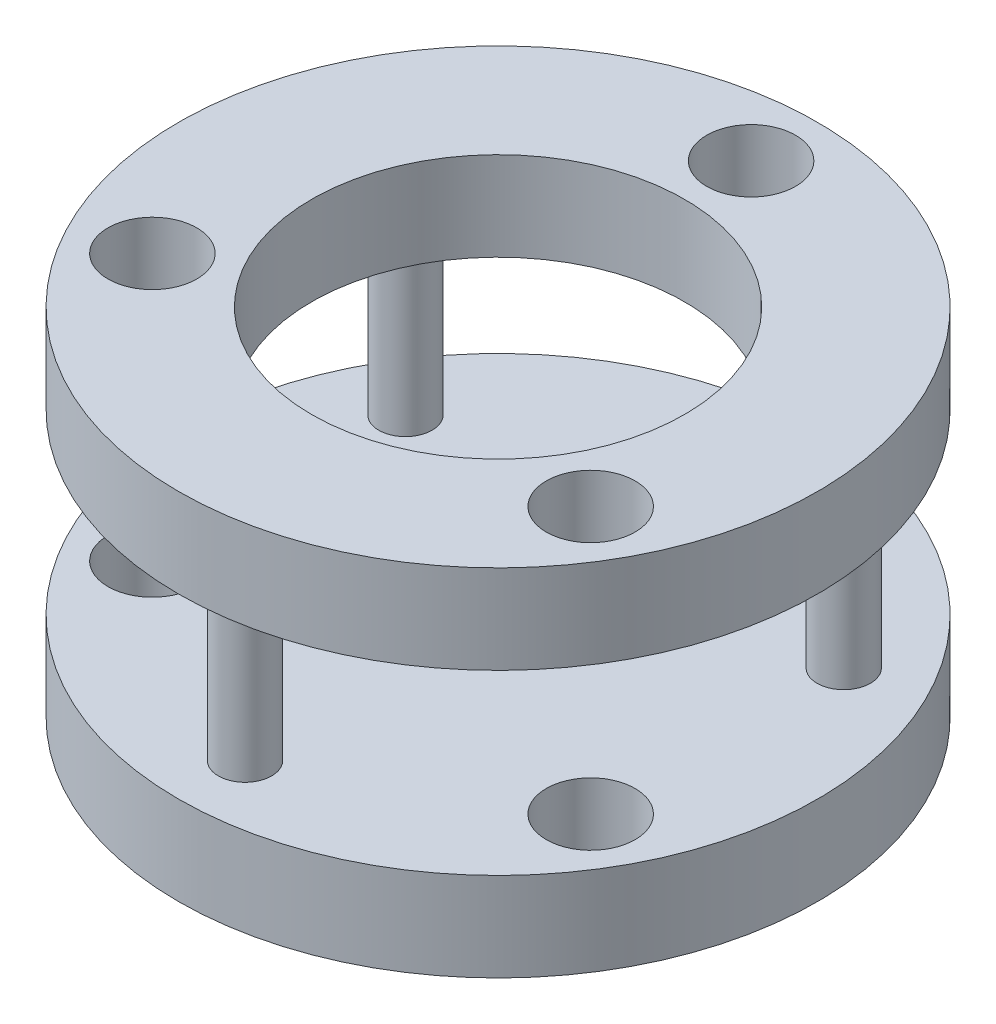
ISO-10303-21;
HEADER;
FILE_DESCRIPTION(('STEP AP214'),'2;1');
FILE_NAME('part.step','',(''),(''),'','','');
FILE_SCHEMA(('AUTOMOTIVE_DESIGN { 1 0 10303 214 1 1 1 1 }'));
ENDSEC;
DATA;
#1=APPLICATION_CONTEXT('core data for automotive mechanical design processes');
#2=APPLICATION_PROTOCOL_DEFINITION('international standard','automotive_design',2000,#1);
#3=PRODUCT_CONTEXT('',#1,'mechanical');
#4=PRODUCT('Part','Part','',(#3));
#5=PRODUCT_RELATED_PRODUCT_CATEGORY('part','',(#4));
#6=PRODUCT_DEFINITION_FORMATION('','',#4);
#7=PRODUCT_DEFINITION_CONTEXT('part definition',#1,'design');
#8=PRODUCT_DEFINITION('design','',#6,#7);
#9=PRODUCT_DEFINITION_SHAPE('','',#8);
#10=(LENGTH_UNIT() NAMED_UNIT(*) SI_UNIT(.MILLI.,.METRE.));
#11=(NAMED_UNIT(*) PLANE_ANGLE_UNIT() SI_UNIT($,.RADIAN.));
#12=(NAMED_UNIT(*) SI_UNIT($,.STERADIAN.) SOLID_ANGLE_UNIT());
#13=UNCERTAINTY_MEASURE_WITH_UNIT(LENGTH_MEASURE(1.E-05),#10,'distance_accuracy_value','');
#14=(GEOMETRIC_REPRESENTATION_CONTEXT(3) GLOBAL_UNCERTAINTY_ASSIGNED_CONTEXT((#13)) GLOBAL_UNIT_ASSIGNED_CONTEXT((#10,
#11,#12)) REPRESENTATION_CONTEXT('',''));
#15=CARTESIAN_POINT('',(0.,0.,0.));
#16=DIRECTION('',(0.,0.,1.));
#17=DIRECTION('',(1.,0.,0.));
#18=AXIS2_PLACEMENT_3D('',#15,#16,#17);
#19=CARTESIAN_POINT('',(24.6817240078567,40.,-14.2500000000001));
#20=DIRECTION('',(0.,-1.,0.));
#21=DIRECTION('',(0.,0.,-1.));
#22=AXIS2_PLACEMENT_3D('',#19,#20,#21);
#23=CYLINDRICAL_SURFACE('',#22,2.99999999999999);
#24=CARTESIAN_POINT('',(24.6817240078567,10.,-14.2500000000001));
#25=DIRECTION('',(0.,1.,0.));
#26=DIRECTION('',(0.,0.,1.));
#27=AXIS2_PLACEMENT_3D('',#24,#25,#26);
#28=CIRCLE('',#27,2.99999999999999);
#29=CARTESIAN_POINT('',(24.6817240078567,10.,-11.2500000000001));
#30=VERTEX_POINT('',#29);
#31=EDGE_CURVE('E78',#30,#30,#28,.T.);
#32=ORIENTED_EDGE('',*,*,#31,.T.);
#33=EDGE_LOOP('',(#32));
#34=FACE_BOUND('',#33,.T.);
#35=CARTESIAN_POINT('',(24.6817240078567,30.,-14.2500000000001));
#36=DIRECTION('',(0.,1.,0.));
#37=DIRECTION('',(0.,0.,1.));
#38=AXIS2_PLACEMENT_3D('',#35,#36,#37);
#39=CIRCLE('',#38,2.99999999999999);
#40=CARTESIAN_POINT('',(24.6817240078567,30.,-11.2500000000001));
#41=VERTEX_POINT('',#40);
#42=EDGE_CURVE('E58',#41,#41,#39,.T.);
#43=ORIENTED_EDGE('',*,*,#42,.F.);
#44=EDGE_LOOP('',(#43));
#45=FACE_BOUND('',#44,.T.);
#46=ADVANCED_FACE('F45',(#34,#45),#23,.T.);
#47=CARTESIAN_POINT('',(-24.6817240078567,40.,-14.2500000000001));
#48=DIRECTION('',(0.,-1.,0.));
#49=DIRECTION('',(0.,0.,-1.));
#50=AXIS2_PLACEMENT_3D('',#47,#48,#49);
#51=CYLINDRICAL_SURFACE('',#50,3.);
#52=CARTESIAN_POINT('',(-24.6817240078567,10.,-14.2500000000001));
#53=DIRECTION('',(0.,1.,0.));
#54=DIRECTION('',(0.,0.,1.));
#55=AXIS2_PLACEMENT_3D('',#52,#53,#54);
#56=CIRCLE('',#55,3.);
#57=CARTESIAN_POINT('',(-24.6817240078567,10.,-11.2500000000001));
#58=VERTEX_POINT('',#57);
#59=EDGE_CURVE('E99',#58,#58,#56,.T.);
#60=ORIENTED_EDGE('',*,*,#59,.T.);
#61=EDGE_LOOP('',(#60));
#62=FACE_BOUND('',#61,.T.);
#63=CARTESIAN_POINT('',(-24.6817240078567,30.,-14.2500000000001));
#64=DIRECTION('',(0.,1.,0.));
#65=DIRECTION('',(0.,0.,1.));
#66=AXIS2_PLACEMENT_3D('',#63,#64,#65);
#67=CIRCLE('',#66,3.);
#68=CARTESIAN_POINT('',(-24.6817240078567,30.,-11.2500000000001));
#69=VERTEX_POINT('',#68);
#70=EDGE_CURVE('E63',#69,#69,#67,.T.);
#71=ORIENTED_EDGE('',*,*,#70,.F.);
#72=EDGE_LOOP('',(#71));
#73=FACE_BOUND('',#72,.T.);
#74=ADVANCED_FACE('F180',(#62,#73),#51,.T.);
#75=CARTESIAN_POINT('',(0.,40.,28.5000000000002));
#76=DIRECTION('',(0.,-1.,0.));
#77=DIRECTION('',(0.,0.,-1.));
#78=AXIS2_PLACEMENT_3D('',#75,#76,#77);
#79=CYLINDRICAL_SURFACE('',#78,3.);
#80=CARTESIAN_POINT('',(0.,10.,28.5000000000002));
#81=DIRECTION('',(0.,1.,0.));
#82=DIRECTION('',(0.,0.,1.));
#83=AXIS2_PLACEMENT_3D('',#80,#81,#82);
#84=CIRCLE('',#83,3.);
#85=CARTESIAN_POINT('',(0.,10.,31.5000000000002));
#86=VERTEX_POINT('',#85);
#87=EDGE_CURVE('E107',#86,#86,#84,.T.);
#88=ORIENTED_EDGE('',*,*,#87,.T.);
#89=EDGE_LOOP('',(#88));
#90=FACE_BOUND('',#89,.T.);
#91=CARTESIAN_POINT('',(0.,30.,28.5000000000002));
#92=DIRECTION('',(0.,1.,0.));
#93=DIRECTION('',(0.,0.,1.));
#94=AXIS2_PLACEMENT_3D('',#91,#92,#93);
#95=CIRCLE('',#94,3.);
#96=CARTESIAN_POINT('',(0.,30.,31.5000000000002));
#97=VERTEX_POINT('',#96);
#98=EDGE_CURVE('E69',#97,#97,#95,.T.);
#99=ORIENTED_EDGE('',*,*,#98,.F.);
#100=EDGE_LOOP('',(#99));
#101=FACE_BOUND('',#100,.T.);
#102=ADVANCED_FACE('F187',(#90,#101),#79,.T.);
#103=CARTESIAN_POINT('',(0.,10.,0.));
#104=DIRECTION('',(0.,-1.,0.));
#105=DIRECTION('',(0.,0.,-1.));
#106=AXIS2_PLACEMENT_3D('',#103,#104,#105);
#107=CYLINDRICAL_SURFACE('',#106,36.0000000000002);
#108=CARTESIAN_POINT('',(0.,10.,0.));
#109=DIRECTION('',(0.,1.,0.));
#110=DIRECTION('',(0.,0.,1.));
#111=AXIS2_PLACEMENT_3D('',#108,#109,#110);
#112=CIRCLE('',#111,36.0000000000002);
#113=CARTESIAN_POINT('',(0.,10.,36.0000000000002));
#114=VERTEX_POINT('',#113);
#115=EDGE_CURVE('E73',#114,#114,#112,.T.);
#116=ORIENTED_EDGE('',*,*,#115,.F.);
#117=EDGE_LOOP('',(#116));
#118=FACE_BOUND('',#117,.T.);
#119=CARTESIAN_POINT('',(0.,0.,0.));
#120=DIRECTION('',(0.,1.,0.));
#121=DIRECTION('',(0.,0.,1.));
#122=AXIS2_PLACEMENT_3D('',#119,#120,#121);
#123=CIRCLE('',#122,36.0000000000002);
#124=CARTESIAN_POINT('',(0.,0.,36.0000000000002));
#125=VERTEX_POINT('',#124);
#126=EDGE_CURVE('E74',#125,#125,#123,.T.);
#127=ORIENTED_EDGE('',*,*,#126,.T.);
#128=EDGE_LOOP('',(#127));
#129=FACE_BOUND('',#128,.T.);
#130=ADVANCED_FACE('F201',(#118,#129),#107,.T.);
#131=CARTESIAN_POINT('',(0.,10.,-28.5000000000003));
#132=DIRECTION('',(0.,-1.,0.));
#133=DIRECTION('',(0.,0.,-1.));
#134=AXIS2_PLACEMENT_3D('',#131,#132,#133);
#135=CYLINDRICAL_SURFACE('',#134,5.00000000000001);
#136=CARTESIAN_POINT('',(0.,10.,-28.5000000000003));
#137=DIRECTION('',(0.,1.,0.));
#138=DIRECTION('',(0.,0.,1.));
#139=AXIS2_PLACEMENT_3D('',#136,#137,#138);
#140=CIRCLE('',#139,5.00000000000001);
#141=CARTESIAN_POINT('',(0.,10.,-23.5000000000003));
#142=VERTEX_POINT('',#141);
#143=EDGE_CURVE('E95',#142,#142,#140,.T.);
#144=ORIENTED_EDGE('',*,*,#143,.T.);
#145=EDGE_LOOP('',(#144));
#146=FACE_BOUND('',#145,.T.);
#147=CARTESIAN_POINT('',(0.,0.,-28.5000000000003));
#148=DIRECTION('',(0.,1.,0.));
#149=DIRECTION('',(0.,0.,1.));
#150=AXIS2_PLACEMENT_3D('',#147,#148,#149);
#151=CIRCLE('',#150,5.00000000000001);
#152=CARTESIAN_POINT('',(0.,0.,-23.5000000000003));
#153=VERTEX_POINT('',#152);
#154=EDGE_CURVE('E79',#153,#153,#151,.T.);
#155=ORIENTED_EDGE('',*,*,#154,.F.);
#156=EDGE_LOOP('',(#155));
#157=FACE_BOUND('',#156,.T.);
#158=ADVANCED_FACE('F204',(#146,#157),#135,.F.);
#159=CARTESIAN_POINT('',(-24.6817240078564,10.,14.2500000000001));
#160=DIRECTION('',(0.,-1.,0.));
#161=DIRECTION('',(0.,0.,-1.));
#162=AXIS2_PLACEMENT_3D('',#159,#160,#161);
#163=CYLINDRICAL_SURFACE('',#162,5.);
#164=CARTESIAN_POINT('',(-24.6817240078564,10.,14.2500000000001));
#165=DIRECTION('',(0.,1.,0.));
#166=DIRECTION('',(0.,0.,1.));
#167=AXIS2_PLACEMENT_3D('',#164,#165,#166);
#168=CIRCLE('',#167,5.);
#169=CARTESIAN_POINT('',(-24.6817240078564,10.,19.2500000000001));
#170=VERTEX_POINT('',#169);
#171=EDGE_CURVE('E103',#170,#170,#168,.T.);
#172=ORIENTED_EDGE('',*,*,#171,.T.);
#173=EDGE_LOOP('',(#172));
#174=FACE_BOUND('',#173,.T.);
#175=CARTESIAN_POINT('',(-24.6817240078564,0.,14.2500000000001));
#176=DIRECTION('',(0.,1.,0.));
#177=DIRECTION('',(0.,0.,1.));
#178=AXIS2_PLACEMENT_3D('',#175,#176,#177);
#179=CIRCLE('',#178,5.);
#180=CARTESIAN_POINT('',(-24.6817240078564,0.,19.2500000000001));
#181=VERTEX_POINT('',#180);
#182=EDGE_CURVE('E83',#181,#181,#179,.T.);
#183=ORIENTED_EDGE('',*,*,#182,.F.);
#184=EDGE_LOOP('',(#183));
#185=FACE_BOUND('',#184,.T.);
#186=ADVANCED_FACE('F208',(#174,#185),#163,.F.);
#187=CARTESIAN_POINT('',(24.6817240078568,10.,14.2499999999999));
#188=DIRECTION('',(0.,-1.,0.));
#189=DIRECTION('',(0.,0.,-1.));
#190=AXIS2_PLACEMENT_3D('',#187,#188,#189);
#191=CYLINDRICAL_SURFACE('',#190,5.00000000000002);
#192=CARTESIAN_POINT('',(24.6817240078568,10.,14.2499999999999));
#193=DIRECTION('',(0.,1.,0.));
#194=DIRECTION('',(0.,0.,1.));
#195=AXIS2_PLACEMENT_3D('',#192,#193,#194);
#196=CIRCLE('',#195,5.00000000000002);
#197=CARTESIAN_POINT('',(24.6817240078568,10.,19.2499999999999));
#198=VERTEX_POINT('',#197);
#199=EDGE_CURVE('E111',#198,#198,#196,.T.);
#200=ORIENTED_EDGE('',*,*,#199,.T.);
#201=EDGE_LOOP('',(#200));
#202=FACE_BOUND('',#201,.T.);
#203=CARTESIAN_POINT('',(24.6817240078568,0.,14.2499999999999));
#204=DIRECTION('',(0.,1.,0.));
#205=DIRECTION('',(0.,0.,1.));
#206=AXIS2_PLACEMENT_3D('',#203,#204,#205);
#207=CIRCLE('',#206,5.00000000000002);
#208=CARTESIAN_POINT('',(24.6817240078568,0.,19.2499999999999));
#209=VERTEX_POINT('',#208);
#210=EDGE_CURVE('E87',#209,#209,#207,.T.);
#211=ORIENTED_EDGE('',*,*,#210,.F.);
#212=EDGE_LOOP('',(#211));
#213=FACE_BOUND('',#212,.T.);
#214=ADVANCED_FACE('F197',(#202,#213),#191,.F.);
#215=CARTESIAN_POINT('',(0.,10.,0.));
#216=DIRECTION('',(0.,1.,0.));
#217=DIRECTION('',(0.,0.,1.));
#218=AXIS2_PLACEMENT_3D('',#215,#216,#217);
#219=PLANE('',#218);
#220=ORIENTED_EDGE('',*,*,#31,.F.);
#221=EDGE_LOOP('',(#220));
#222=FACE_BOUND('',#221,.T.);
#223=ORIENTED_EDGE('',*,*,#199,.F.);
#224=EDGE_LOOP('',(#223));
#225=FACE_BOUND('',#224,.T.);
#226=ORIENTED_EDGE('',*,*,#87,.F.);
#227=EDGE_LOOP('',(#226));
#228=FACE_BOUND('',#227,.T.);
#229=ORIENTED_EDGE('',*,*,#171,.F.);
#230=EDGE_LOOP('',(#229));
#231=FACE_BOUND('',#230,.T.);
#232=ORIENTED_EDGE('',*,*,#59,.F.);
#233=EDGE_LOOP('',(#232));
#234=FACE_BOUND('',#233,.T.);
#235=ORIENTED_EDGE('',*,*,#143,.F.);
#236=EDGE_LOOP('',(#235));
#237=FACE_BOUND('',#236,.T.);
#238=ORIENTED_EDGE('',*,*,#115,.T.);
#239=EDGE_LOOP('',(#238));
#240=FACE_BOUND('',#239,.T.);
#241=ADVANCED_FACE('F193',(#222,#225,#228,#231,#234,#237,#240),#219,.T.);
#242=CARTESIAN_POINT('',(0.,0.,0.));
#243=DIRECTION('',(0.,1.,0.));
#244=DIRECTION('',(0.,0.,1.));
#245=AXIS2_PLACEMENT_3D('',#242,#243,#244);
#246=PLANE('',#245);
#247=CARTESIAN_POINT('',(0.,0.,0.));
#248=DIRECTION('',(0.,1.,0.));
#249=DIRECTION('',(0.,0.,1.));
#250=AXIS2_PLACEMENT_3D('',#247,#248,#249);
#251=CIRCLE('',#250,15.);
#252=CARTESIAN_POINT('',(0.,0.,15.));
#253=VERTEX_POINT('',#252);
#254=EDGE_CURVE('E10',#253,#253,#251,.T.);
#255=ORIENTED_EDGE('',*,*,#254,.T.);
#256=EDGE_LOOP('',(#255));
#257=FACE_BOUND('',#256,.T.);
#258=ORIENTED_EDGE('',*,*,#210,.T.);
#259=EDGE_LOOP('',(#258));
#260=FACE_BOUND('',#259,.T.);
#261=ORIENTED_EDGE('',*,*,#182,.T.);
#262=EDGE_LOOP('',(#261));
#263=FACE_BOUND('',#262,.T.);
#264=ORIENTED_EDGE('',*,*,#154,.T.);
#265=EDGE_LOOP('',(#264));
#266=FACE_BOUND('',#265,.T.);
#267=ORIENTED_EDGE('',*,*,#126,.F.);
#268=EDGE_LOOP('',(#267));
#269=FACE_BOUND('',#268,.T.);
#270=ADVANCED_FACE('F196',(#257,#260,#263,#266,#269),#246,.F.);
#271=CARTESIAN_POINT('',(0.,40.,0.));
#272=DIRECTION('',(0.,-1.,0.));
#273=DIRECTION('',(0.,0.,-1.));
#274=AXIS2_PLACEMENT_3D('',#271,#272,#273);
#275=CYLINDRICAL_SURFACE('',#274,36.0000000000002);
#276=CARTESIAN_POINT('',(0.,40.,0.));
#277=DIRECTION('',(0.,1.,0.));
#278=DIRECTION('',(0.,0.,1.));
#279=AXIS2_PLACEMENT_3D('',#276,#277,#278);
#280=CIRCLE('',#279,36.0000000000002);
#281=CARTESIAN_POINT('',(0.,40.,36.0000000000002));
#282=VERTEX_POINT('',#281);
#283=EDGE_CURVE('E143',#282,#282,#280,.T.);
#284=ORIENTED_EDGE('',*,*,#283,.F.);
#285=EDGE_LOOP('',(#284));
#286=FACE_BOUND('',#285,.T.);
#287=CARTESIAN_POINT('',(0.,30.,0.));
#288=DIRECTION('',(0.,1.,0.));
#289=DIRECTION('',(0.,0.,1.));
#290=AXIS2_PLACEMENT_3D('',#287,#288,#289);
#291=CIRCLE('',#290,36.0000000000002);
#292=CARTESIAN_POINT('',(0.,30.,36.0000000000002));
#293=VERTEX_POINT('',#292);
#294=EDGE_CURVE('E123',#293,#293,#291,.T.);
#295=ORIENTED_EDGE('',*,*,#294,.T.);
#296=EDGE_LOOP('',(#295));
#297=FACE_BOUND('',#296,.T.);
#298=ADVANCED_FACE('F200',(#286,#297),#275,.T.);
#299=CARTESIAN_POINT('',(0.,40.,-28.5000000000003));
#300=DIRECTION('',(0.,-1.,0.));
#301=DIRECTION('',(0.,0.,-1.));
#302=AXIS2_PLACEMENT_3D('',#299,#300,#301);
#303=CYLINDRICAL_SURFACE('',#302,5.00000000000001);
#304=CARTESIAN_POINT('',(0.,40.,-28.5000000000003));
#305=DIRECTION('',(0.,1.,0.));
#306=DIRECTION('',(0.,0.,1.));
#307=AXIS2_PLACEMENT_3D('',#304,#305,#306);
#308=CIRCLE('',#307,5.00000000000001);
#309=CARTESIAN_POINT('',(0.,40.,-23.5000000000003));
#310=VERTEX_POINT('',#309);
#311=EDGE_CURVE('E147',#310,#310,#308,.T.);
#312=ORIENTED_EDGE('',*,*,#311,.T.);
#313=EDGE_LOOP('',(#312));
#314=FACE_BOUND('',#313,.T.);
#315=CARTESIAN_POINT('',(0.,30.,-28.5000000000003));
#316=DIRECTION('',(0.,1.,0.));
#317=DIRECTION('',(0.,0.,1.));
#318=AXIS2_PLACEMENT_3D('',#315,#316,#317);
#319=CIRCLE('',#318,5.00000000000001);
#320=CARTESIAN_POINT('',(0.,30.,-23.5000000000003));
#321=VERTEX_POINT('',#320);
#322=EDGE_CURVE('E127',#321,#321,#319,.T.);
#323=ORIENTED_EDGE('',*,*,#322,.F.);
#324=EDGE_LOOP('',(#323));
#325=FACE_BOUND('',#324,.T.);
#326=ADVANCED_FACE('F265',(#314,#325),#303,.F.);
#327=CARTESIAN_POINT('',(-24.6817240078564,40.,14.2500000000001));
#328=DIRECTION('',(0.,-1.,0.));
#329=DIRECTION('',(0.,0.,-1.));
#330=AXIS2_PLACEMENT_3D('',#327,#328,#329);
#331=CYLINDRICAL_SURFACE('',#330,5.);
#332=CARTESIAN_POINT('',(-24.6817240078564,40.,14.2500000000001));
#333=DIRECTION('',(0.,1.,0.));
#334=DIRECTION('',(0.,0.,1.));
#335=AXIS2_PLACEMENT_3D('',#332,#333,#334);
#336=CIRCLE('',#335,5.);
#337=CARTESIAN_POINT('',(-24.6817240078564,40.,19.2500000000001));
#338=VERTEX_POINT('',#337);
#339=EDGE_CURVE('E151',#338,#338,#336,.T.);
#340=ORIENTED_EDGE('',*,*,#339,.T.);
#341=EDGE_LOOP('',(#340));
#342=FACE_BOUND('',#341,.T.);
#343=CARTESIAN_POINT('',(-24.6817240078564,30.,14.2500000000001));
#344=DIRECTION('',(0.,1.,0.));
#345=DIRECTION('',(0.,0.,1.));
#346=AXIS2_PLACEMENT_3D('',#343,#344,#345);
#347=CIRCLE('',#346,5.);
#348=CARTESIAN_POINT('',(-24.6817240078564,30.,19.2500000000001));
#349=VERTEX_POINT('',#348);
#350=EDGE_CURVE('E131',#349,#349,#347,.T.);
#351=ORIENTED_EDGE('',*,*,#350,.F.);
#352=EDGE_LOOP('',(#351));
#353=FACE_BOUND('',#352,.T.);
#354=ADVANCED_FACE('F259',(#342,#353),#331,.F.);
#355=CARTESIAN_POINT('',(24.6817240078568,40.,14.2499999999999));
#356=DIRECTION('',(0.,-1.,0.));
#357=DIRECTION('',(0.,0.,-1.));
#358=AXIS2_PLACEMENT_3D('',#355,#356,#357);
#359=CYLINDRICAL_SURFACE('',#358,5.00000000000002);
#360=CARTESIAN_POINT('',(24.6817240078568,40.,14.2499999999999));
#361=DIRECTION('',(0.,1.,0.));
#362=DIRECTION('',(0.,0.,1.));
#363=AXIS2_PLACEMENT_3D('',#360,#361,#362);
#364=CIRCLE('',#363,5.00000000000002);
#365=CARTESIAN_POINT('',(24.6817240078568,40.,19.2499999999999));
#366=VERTEX_POINT('',#365);
#367=EDGE_CURVE('E122',#366,#366,#364,.T.);
#368=ORIENTED_EDGE('',*,*,#367,.T.);
#369=EDGE_LOOP('',(#368));
#370=FACE_BOUND('',#369,.T.);
#371=CARTESIAN_POINT('',(24.6817240078568,30.,14.2499999999999));
#372=DIRECTION('',(0.,1.,0.));
#373=DIRECTION('',(0.,0.,1.));
#374=AXIS2_PLACEMENT_3D('',#371,#372,#373);
#375=CIRCLE('',#374,5.00000000000002);
#376=CARTESIAN_POINT('',(24.6817240078568,30.,19.2499999999999));
#377=VERTEX_POINT('',#376);
#378=EDGE_CURVE('E135',#377,#377,#375,.T.);
#379=ORIENTED_EDGE('',*,*,#378,.F.);
#380=EDGE_LOOP('',(#379));
#381=FACE_BOUND('',#380,.T.);
#382=ADVANCED_FACE('F253',(#370,#381),#359,.F.);
#383=CARTESIAN_POINT('',(0.,40.,0.));
#384=DIRECTION('',(0.,-1.,0.));
#385=DIRECTION('',(0.,0.,-1.));
#386=AXIS2_PLACEMENT_3D('',#383,#384,#385);
#387=CYLINDRICAL_SURFACE('',#386,21.0000000000002);
#388=CARTESIAN_POINT('',(0.,40.,0.));
#389=DIRECTION('',(0.,1.,0.));
#390=DIRECTION('',(0.,0.,1.));
#391=AXIS2_PLACEMENT_3D('',#388,#389,#390);
#392=CIRCLE('',#391,21.0000000000002);
#393=CARTESIAN_POINT('',(0.,40.,21.0000000000002));
#394=VERTEX_POINT('',#393);
#395=EDGE_CURVE('E91',#394,#394,#392,.T.);
#396=ORIENTED_EDGE('',*,*,#395,.T.);
#397=EDGE_LOOP('',(#396));
#398=FACE_BOUND('',#397,.T.);
#399=CARTESIAN_POINT('',(0.,30.,0.));
#400=DIRECTION('',(0.,1.,0.));
#401=DIRECTION('',(0.,0.,1.));
#402=AXIS2_PLACEMENT_3D('',#399,#400,#401);
#403=CIRCLE('',#402,21.0000000000002);
#404=CARTESIAN_POINT('',(0.,30.,21.0000000000002));
#405=VERTEX_POINT('',#404);
#406=EDGE_CURVE('E118',#405,#405,#403,.T.);
#407=ORIENTED_EDGE('',*,*,#406,.F.);
#408=EDGE_LOOP('',(#407));
#409=FACE_BOUND('',#408,.T.);
#410=ADVANCED_FACE('F244',(#398,#409),#387,.F.);
#411=CARTESIAN_POINT('',(0.,30.,0.));
#412=DIRECTION('',(0.,1.,0.));
#413=DIRECTION('',(0.,0.,1.));
#414=AXIS2_PLACEMENT_3D('',#411,#412,#413);
#415=PLANE('',#414);
#416=ORIENTED_EDGE('',*,*,#42,.T.);
#417=EDGE_LOOP('',(#416));
#418=FACE_BOUND('',#417,.T.);
#419=ORIENTED_EDGE('',*,*,#378,.T.);
#420=EDGE_LOOP('',(#419));
#421=FACE_BOUND('',#420,.T.);
#422=ORIENTED_EDGE('',*,*,#98,.T.);
#423=EDGE_LOOP('',(#422));
#424=FACE_BOUND('',#423,.T.);
#425=ORIENTED_EDGE('',*,*,#350,.T.);
#426=EDGE_LOOP('',(#425));
#427=FACE_BOUND('',#426,.T.);
#428=ORIENTED_EDGE('',*,*,#70,.T.);
#429=EDGE_LOOP('',(#428));
#430=FACE_BOUND('',#429,.T.);
#431=ORIENTED_EDGE('',*,*,#322,.T.);
#432=EDGE_LOOP('',(#431));
#433=FACE_BOUND('',#432,.T.);
#434=ORIENTED_EDGE('',*,*,#294,.F.);
#435=EDGE_LOOP('',(#434));
#436=FACE_BOUND('',#435,.T.);
#437=ORIENTED_EDGE('',*,*,#406,.T.);
#438=EDGE_LOOP('',(#437));
#439=FACE_BOUND('',#438,.T.);
#440=ADVANCED_FACE('F175',(#418,#421,#424,#427,#430,#433,#436,#439),#415,.F.);
#441=CARTESIAN_POINT('',(0.,40.,28.5000000000002));
#442=DIRECTION('',(0.,1.,0.));
#443=DIRECTION('',(0.,0.,1.));
#444=AXIS2_PLACEMENT_3D('',#441,#442,#443);
#445=PLANE('',#444);
#446=ORIENTED_EDGE('',*,*,#367,.F.);
#447=EDGE_LOOP('',(#446));
#448=FACE_BOUND('',#447,.T.);
#449=ORIENTED_EDGE('',*,*,#339,.F.);
#450=EDGE_LOOP('',(#449));
#451=FACE_BOUND('',#450,.T.);
#452=ORIENTED_EDGE('',*,*,#311,.F.);
#453=EDGE_LOOP('',(#452));
#454=FACE_BOUND('',#453,.T.);
#455=ORIENTED_EDGE('',*,*,#283,.T.);
#456=EDGE_LOOP('',(#455));
#457=FACE_BOUND('',#456,.T.);
#458=ORIENTED_EDGE('',*,*,#395,.F.);
#459=EDGE_LOOP('',(#458));
#460=FACE_BOUND('',#459,.T.);
#461=ADVANCED_FACE('F166',(#448,#451,#454,#457,#460),#445,.T.);
#462=CARTESIAN_POINT('',(0.,-20.,0.));
#463=DIRECTION('',(0.,1.,0.));
#464=DIRECTION('',(0.,0.,1.));
#465=AXIS2_PLACEMENT_3D('',#462,#463,#464);
#466=CYLINDRICAL_SURFACE('',#465,5.);
#467=CARTESIAN_POINT('',(0.,-10.,0.));
#468=DIRECTION('',(0.,1.,0.));
#469=DIRECTION('',(0.,0.,1.));
#470=AXIS2_PLACEMENT_3D('',#467,#468,#469);
#471=CIRCLE('',#470,5.);
#472=CARTESIAN_POINT('',(0.,-10.,5.));
#473=VERTEX_POINT('',#472);
#474=EDGE_CURVE('E53',#473,#473,#471,.F.);
#475=ORIENTED_EDGE('',*,*,#474,.T.);
#476=EDGE_LOOP('',(#475));
#477=FACE_BOUND('',#476,.T.);
#478=CARTESIAN_POINT('',(0.,-20.,0.));
#479=DIRECTION('',(0.,-1.,0.));
#480=DIRECTION('',(0.,0.,-1.));
#481=AXIS2_PLACEMENT_3D('',#478,#479,#480);
#482=CIRCLE('',#481,5.);
#483=CARTESIAN_POINT('',(0.,-20.,-5.));
#484=VERTEX_POINT('',#483);
#485=EDGE_CURVE('E139',#484,#484,#482,.T.);
#486=ORIENTED_EDGE('',*,*,#485,.F.);
#487=EDGE_LOOP('',(#486));
#488=FACE_BOUND('',#487,.T.);
#489=ADVANCED_FACE('F164',(#477,#488),#466,.T.);
#490=CARTESIAN_POINT('',(0.,-20.,0.));
#491=DIRECTION('',(0.,-1.,0.));
#492=DIRECTION('',(0.,0.,-1.));
#493=AXIS2_PLACEMENT_3D('',#490,#491,#492);
#494=PLANE('',#493);
#495=ORIENTED_EDGE('',*,*,#485,.T.);
#496=EDGE_LOOP('',(#495));
#497=FACE_BOUND('',#496,.T.);
#498=ADVANCED_FACE('F162',(#497),#494,.T.);
#499=CARTESIAN_POINT('',(0.,-10.,0.));
#500=DIRECTION('',(0.,1.,0.));
#501=DIRECTION('',(0.,0.,1.));
#502=AXIS2_PLACEMENT_3D('',#499,#500,#501);
#503=TOROIDAL_SURFACE('',#502,15.,10.);
#504=ORIENTED_EDGE('',*,*,#254,.F.);
#505=EDGE_LOOP('',(#504));
#506=FACE_BOUND('',#505,.T.);
#507=ORIENTED_EDGE('',*,*,#474,.F.);
#508=EDGE_LOOP('',(#507));
#509=FACE_BOUND('',#508,.T.);
#510=ADVANCED_FACE('F47',(#506,#509),#503,.F.);
#511=CLOSED_SHELL('',(#46,#74,#102,#130,#158,#186,#214,#241,#270,#298,#326,#354,#382,#410,#440,
#461,#489,#498,#510));
#512=MANIFOLD_SOLID_BREP('B2',#511);
#513=ADVANCED_BREP_SHAPE_REPRESENTATION('',(#18,#512),#14);
#514=SHAPE_DEFINITION_REPRESENTATION(#9,#513);
ENDSEC;
END-ISO-10303-21;
